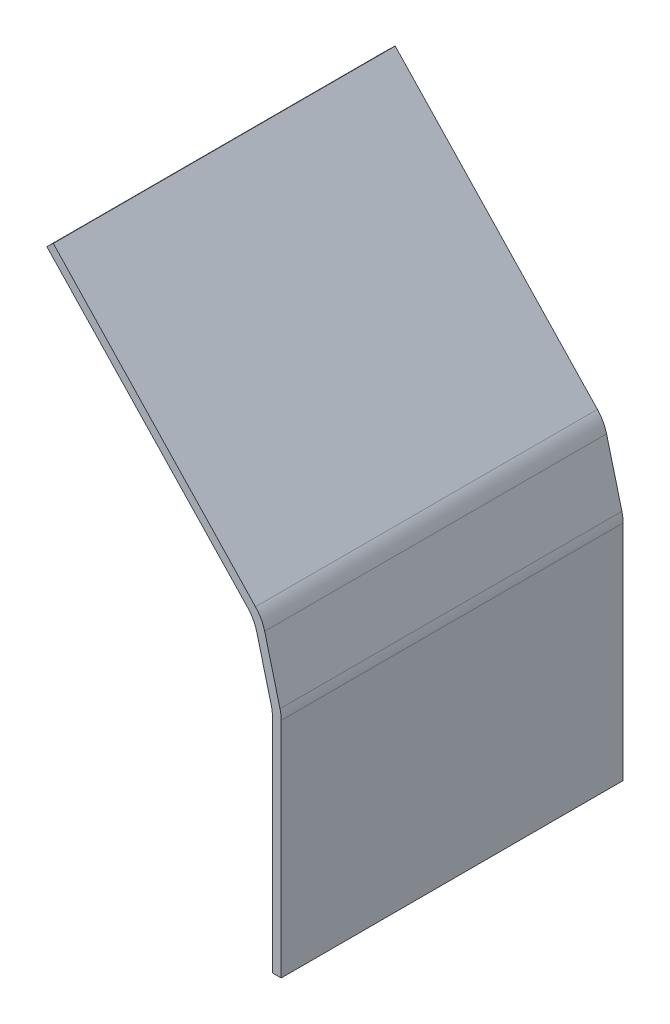
ISO-10303-21;
HEADER;
FILE_DESCRIPTION(('STEP AP214'),'2;1');
FILE_NAME('part.step','',(''),(''),'','','');
FILE_SCHEMA(('AUTOMOTIVE_DESIGN { 1 0 10303 214 1 1 1 1 }'));
ENDSEC;
DATA;
#1=APPLICATION_CONTEXT('core data for automotive mechanical design processes');
#2=APPLICATION_PROTOCOL_DEFINITION('international standard','automotive_design',2000,#1);
#3=PRODUCT_CONTEXT('',#1,'mechanical');
#4=PRODUCT('Part','Part','',(#3));
#5=PRODUCT_RELATED_PRODUCT_CATEGORY('part','',(#4));
#6=PRODUCT_DEFINITION_FORMATION('','',#4);
#7=PRODUCT_DEFINITION_CONTEXT('part definition',#1,'design');
#8=PRODUCT_DEFINITION('design','',#6,#7);
#9=PRODUCT_DEFINITION_SHAPE('','',#8);
#10=(LENGTH_UNIT() NAMED_UNIT(*) SI_UNIT(.MILLI.,.METRE.));
#11=(NAMED_UNIT(*) PLANE_ANGLE_UNIT() SI_UNIT($,.RADIAN.));
#12=(NAMED_UNIT(*) SI_UNIT($,.STERADIAN.) SOLID_ANGLE_UNIT());
#13=UNCERTAINTY_MEASURE_WITH_UNIT(LENGTH_MEASURE(1.E-05),#10,'distance_accuracy_value','');
#14=(GEOMETRIC_REPRESENTATION_CONTEXT(3) GLOBAL_UNCERTAINTY_ASSIGNED_CONTEXT((#13)) GLOBAL_UNIT_ASSIGNED_CONTEXT((#10,
#11,#12)) REPRESENTATION_CONTEXT('',''));
#15=CARTESIAN_POINT('',(0.,0.,0.));
#16=DIRECTION('',(0.,0.,1.));
#17=DIRECTION('',(1.,0.,0.));
#18=AXIS2_PLACEMENT_3D('',#15,#16,#17);
#19=CARTESIAN_POINT('',(-1.4732,0.,-57.15));
#20=DIRECTION('',(0.,-1.,0.));
#21=DIRECTION('',(0.,0.,-1.));
#22=AXIS2_PLACEMENT_3D('',#19,#20,#21);
#23=PLANE('',#22);
#24=DIRECTION('',(1.,0.,0.));
#25=VECTOR('',#24,1.);
#26=CARTESIAN_POINT('',(-1.4732,0.,0.));
#27=LINE('',#26,#25);
#28=CARTESIAN_POINT('',(-1.4732,0.,0.));
#29=VERTEX_POINT('',#28);
#30=CARTESIAN_POINT('',(0.,0.,0.));
#31=VERTEX_POINT('',#30);
#32=EDGE_CURVE('E184',#29,#31,#27,.T.);
#33=ORIENTED_EDGE('',*,*,#32,.F.);
#34=DIRECTION('',(0.,0.,1.));
#35=VECTOR('',#34,1.);
#36=CARTESIAN_POINT('',(-1.4732,0.,-57.15));
#37=LINE('',#36,#35);
#38=CARTESIAN_POINT('',(-1.4732,0.,-57.15));
#39=VERTEX_POINT('',#38);
#40=EDGE_CURVE('E157',#39,#29,#37,.T.);
#41=ORIENTED_EDGE('',*,*,#40,.F.);
#42=DIRECTION('',(1.,0.,0.));
#43=VECTOR('',#42,1.);
#44=CARTESIAN_POINT('',(-1.4732,0.,-57.15));
#45=LINE('',#44,#43);
#46=CARTESIAN_POINT('',(0.,0.,-57.15));
#47=VERTEX_POINT('',#46);
#48=EDGE_CURVE('E149',#39,#47,#45,.T.);
#49=ORIENTED_EDGE('',*,*,#48,.T.);
#50=DIRECTION('',(0.,0.,1.));
#51=VECTOR('',#50,1.);
#52=CARTESIAN_POINT('',(0.,0.,-57.15));
#53=LINE('',#52,#51);
#54=EDGE_CURVE('E129',#47,#31,#53,.T.);
#55=ORIENTED_EDGE('',*,*,#54,.T.);
#56=EDGE_LOOP('',(#33,#41,#49,#55));
#57=FACE_BOUND('',#56,.T.);
#58=ADVANCED_FACE('F39',(#57),#23,.T.);
#59=CARTESIAN_POINT('',(-1.4732,0.,-57.15));
#60=DIRECTION('',(-1.,0.,0.));
#61=DIRECTION('',(0.,0.,1.));
#62=AXIS2_PLACEMENT_3D('',#59,#60,#61);
#63=PLANE('',#62);
#64=DIRECTION('',(0.,-1.,0.));
#65=VECTOR('',#64,1.);
#66=CARTESIAN_POINT('',(-1.4732,0.,0.));
#67=LINE('',#66,#65);
#68=CARTESIAN_POINT('',(-1.4732,37.1063233140499,0.));
#69=VERTEX_POINT('',#68);
#70=EDGE_CURVE('E159',#69,#29,#67,.T.);
#71=ORIENTED_EDGE('',*,*,#70,.F.);
#72=DIRECTION('',(0.,0.,1.));
#73=VECTOR('',#72,1.);
#74=CARTESIAN_POINT('',(-1.4732,37.1063233140499,-57.15));
#75=LINE('',#74,#73);
#76=CARTESIAN_POINT('',(-1.4732,37.1063233140499,-57.15));
#77=VERTEX_POINT('',#76);
#78=EDGE_CURVE('E246',#69,#77,#75,.F.);
#79=ORIENTED_EDGE('',*,*,#78,.T.);
#80=DIRECTION('',(0.,-1.,0.));
#81=VECTOR('',#80,1.);
#82=CARTESIAN_POINT('',(-1.4732,0.,-57.15));
#83=LINE('',#82,#81);
#84=EDGE_CURVE('E143',#77,#39,#83,.T.);
#85=ORIENTED_EDGE('',*,*,#84,.T.);
#86=ORIENTED_EDGE('',*,*,#40,.T.);
#87=EDGE_LOOP('',(#71,#79,#85,#86));
#88=FACE_BOUND('',#87,.T.);
#89=ADVANCED_FACE('F298',(#88),#63,.T.);
#90=CARTESIAN_POINT('',(-4.50632511531431,49.6601221242085,-57.15));
#91=DIRECTION('',(-0.968245836551854,-0.25,0.));
#92=DIRECTION('',(0.25,-0.968245836551854,0.));
#93=AXIS2_PLACEMENT_3D('',#90,#91,#92);
#94=PLANE('',#93);
#95=DIRECTION('',(0.25,-0.968245836551854,0.));
#96=VECTOR('',#95,1.);
#97=CARTESIAN_POINT('',(-4.50632511531431,49.6601221242085,-57.15));
#98=LINE('',#97,#96);
#99=CARTESIAN_POINT('',(-4.0964343778407,48.0726221242086,-57.15));
#100=VERTEX_POINT('',#99);
#101=CARTESIAN_POINT('',(-1.67483893789573,38.6938233140499,-57.15));
#102=VERTEX_POINT('',#101);
#103=EDGE_CURVE('E178',#100,#102,#98,.T.);
#104=ORIENTED_EDGE('',*,*,#103,.T.);
#105=DIRECTION('',(0.,0.,1.));
#106=VECTOR('',#105,1.);
#107=CARTESIAN_POINT('',(-1.67483893789573,38.6938233140499,0.));
#108=LINE('',#107,#106);
#109=CARTESIAN_POINT('',(-1.67483893789573,38.6938233140499,0.));
#110=VERTEX_POINT('',#109);
#111=EDGE_CURVE('E242',#102,#110,#108,.T.);
#112=ORIENTED_EDGE('',*,*,#111,.T.);
#113=DIRECTION('',(0.25,-0.968245836551854,0.));
#114=VECTOR('',#113,1.);
#115=CARTESIAN_POINT('',(-4.50632511531431,49.6601221242085,0.));
#116=LINE('',#115,#114);
#117=CARTESIAN_POINT('',(-4.0964343778407,48.0726221242086,0.));
#118=VERTEX_POINT('',#117);
#119=EDGE_CURVE('E162',#118,#110,#116,.T.);
#120=ORIENTED_EDGE('',*,*,#119,.F.);
#121=DIRECTION('',(0.,0.,1.));
#122=VECTOR('',#121,1.);
#123=CARTESIAN_POINT('',(-4.0964343778407,48.0726221242086,-57.15));
#124=LINE('',#123,#122);
#125=EDGE_CURVE('E239',#118,#100,#124,.F.);
#126=ORIENTED_EDGE('',*,*,#125,.T.);
#127=EDGE_LOOP('',(#104,#112,#120,#126));
#128=FACE_BOUND('',#127,.T.);
#129=ADVANCED_FACE('F263',(#128),#94,.T.);
#130=CARTESIAN_POINT('',(-4.50632511531431,49.6601221242085,-57.15));
#131=DIRECTION('',(-0.726184377413891,-0.6875,0.));
#132=DIRECTION('',(0.6875,-0.726184377413891,0.));
#133=AXIS2_PLACEMENT_3D('',#130,#131,#132);
#134=PLANE('',#133);
#135=DIRECTION('',(0.6875,-0.726184377413891,0.));
#136=VECTOR('',#135,1.);
#137=CARTESIAN_POINT('',(-4.50632511531431,49.6601221242085,-57.15));
#138=LINE('',#137,#136);
#139=CARTESIAN_POINT('',(-39.1698148248062,86.2740634968342,-57.15));
#140=VERTEX_POINT('',#139);
#141=CARTESIAN_POINT('',(-5.63352464336677,50.8507471242085,-57.15));
#142=VERTEX_POINT('',#141);
#143=EDGE_CURVE('E175',#140,#142,#138,.T.);
#144=ORIENTED_EDGE('',*,*,#143,.T.);
#145=DIRECTION('',(0.,0.,1.));
#146=VECTOR('',#145,1.);
#147=CARTESIAN_POINT('',(-5.63352464336677,50.8507471242085,0.));
#148=LINE('',#147,#146);
#149=CARTESIAN_POINT('',(-5.63352464336677,50.8507471242085,0.));
#150=VERTEX_POINT('',#149);
#151=EDGE_CURVE('E249',#142,#150,#148,.T.);
#152=ORIENTED_EDGE('',*,*,#151,.T.);
#153=DIRECTION('',(0.6875,-0.726184377413891,0.));
#154=VECTOR('',#153,1.);
#155=CARTESIAN_POINT('',(-4.50632511531431,49.6601221242085,0.));
#156=LINE('',#155,#154);
#157=CARTESIAN_POINT('',(-39.1698148248062,86.2740634968342,0.));
#158=VERTEX_POINT('',#157);
#159=EDGE_CURVE('E200',#158,#150,#156,.T.);
#160=ORIENTED_EDGE('',*,*,#159,.F.);
#161=DIRECTION('',(0.,0.,1.));
#162=VECTOR('',#161,1.);
#163=CARTESIAN_POINT('',(-39.1698148248062,86.2740634968342,-57.15));
#164=LINE('',#163,#162);
#165=EDGE_CURVE('E210',#140,#158,#164,.T.);
#166=ORIENTED_EDGE('',*,*,#165,.F.);
#167=EDGE_LOOP('',(#144,#152,#160,#166));
#168=FACE_BOUND('',#167,.T.);
#169=ADVANCED_FACE('F266',(#168),#134,.T.);
#170=CARTESIAN_POINT('',(-39.1698148248062,86.2740634968342,-57.15));
#171=DIRECTION('',(-0.687499999999999,0.726184377413892,0.));
#172=DIRECTION('',(-0.726184377413892,-0.687499999999999,0.));
#173=AXIS2_PLACEMENT_3D('',#170,#171,#172);
#174=PLANE('',#173);
#175=DIRECTION('',(-0.726184377413892,-0.687499999999999,0.));
#176=VECTOR('',#175,1.);
#177=CARTESIAN_POINT('',(-39.1698148248062,86.2740634968342,0.));
#178=LINE('',#177,#176);
#179=CARTESIAN_POINT('',(-38.1,87.2868884968342,0.));
#180=VERTEX_POINT('',#179);
#181=EDGE_CURVE('E196',#180,#158,#178,.T.);
#182=ORIENTED_EDGE('',*,*,#181,.F.);
#183=DIRECTION('',(0.,0.,1.));
#184=VECTOR('',#183,1.);
#185=CARTESIAN_POINT('',(-38.1,87.2868884968342,-57.15));
#186=LINE('',#185,#184);
#187=CARTESIAN_POINT('',(-38.1,87.2868884968342,-57.15));
#188=VERTEX_POINT('',#187);
#189=EDGE_CURVE('E142',#188,#180,#186,.T.);
#190=ORIENTED_EDGE('',*,*,#189,.F.);
#191=DIRECTION('',(-0.726184377413892,-0.687499999999999,0.));
#192=VECTOR('',#191,1.);
#193=CARTESIAN_POINT('',(-39.1698148248062,86.2740634968342,-57.15));
#194=LINE('',#193,#192);
#195=EDGE_CURVE('E171',#188,#140,#194,.T.);
#196=ORIENTED_EDGE('',*,*,#195,.T.);
#197=ORIENTED_EDGE('',*,*,#165,.T.);
#198=EDGE_LOOP('',(#182,#190,#196,#197));
#199=FACE_BOUND('',#198,.T.);
#200=ADVANCED_FACE('F272',(#199),#174,.T.);
#201=CARTESIAN_POINT('',(-3.17500000000001,50.3967221242086,-57.15));
#202=DIRECTION('',(0.726184377413891,0.6875,0.));
#203=DIRECTION('',(-0.6875,0.726184377413891,0.));
#204=AXIS2_PLACEMENT_3D('',#201,#202,#203);
#205=PLANE('',#204);
#206=DIRECTION('',(-0.6875,0.72618437741389,0.));
#207=VECTOR('',#206,1.);
#208=CARTESIAN_POINT('',(-3.17500000000001,50.3967221242086,0.));
#209=LINE('',#208,#207);
#210=CARTESIAN_POINT('',(-4.30219952805246,51.5873471242085,0.));
#211=VERTEX_POINT('',#210);
#212=EDGE_CURVE('E193',#211,#180,#209,.T.);
#213=ORIENTED_EDGE('',*,*,#212,.F.);
#214=DIRECTION('',(0.,0.,1.));
#215=VECTOR('',#214,1.);
#216=CARTESIAN_POINT('',(-4.30219952805246,51.5873471242085,-57.15));
#217=LINE('',#216,#215);
#218=CARTESIAN_POINT('',(-4.30219952805246,51.5873471242085,-57.15));
#219=VERTEX_POINT('',#218);
#220=EDGE_CURVE('E236',#211,#219,#217,.F.);
#221=ORIENTED_EDGE('',*,*,#220,.T.);
#222=DIRECTION('',(-0.6875,0.72618437741389,0.));
#223=VECTOR('',#222,1.);
#224=CARTESIAN_POINT('',(-3.17500000000001,50.3967221242086,-57.15));
#225=LINE('',#224,#223);
#226=EDGE_CURVE('E168',#219,#188,#225,.T.);
#227=ORIENTED_EDGE('',*,*,#226,.T.);
#228=ORIENTED_EDGE('',*,*,#189,.T.);
#229=EDGE_LOOP('',(#213,#221,#227,#228));
#230=FACE_BOUND('',#229,.T.);
#231=ADVANCED_FACE('F275',(#230),#205,.T.);
#232=CARTESIAN_POINT('',(-3.17500000000001,50.3967221242086,-57.15));
#233=DIRECTION('',(0.968245836551854,0.25,0.));
#234=DIRECTION('',(-0.25,0.968245836551854,0.));
#235=AXIS2_PLACEMENT_3D('',#232,#233,#234);
#236=PLANE('',#235);
#237=DIRECTION('',(-0.25,0.968245836551854,0.));
#238=VECTOR('',#237,1.);
#239=CARTESIAN_POINT('',(-3.17500000000001,50.3967221242086,0.));
#240=LINE('',#239,#238);
#241=CARTESIAN_POINT('',(-0.201638937895728,38.8809442484171,0.));
#242=VERTEX_POINT('',#241);
#243=CARTESIAN_POINT('',(-2.76510926252639,48.8092221242086,0.));
#244=VERTEX_POINT('',#243);
#245=EDGE_CURVE('E189',#242,#244,#240,.T.);
#246=ORIENTED_EDGE('',*,*,#245,.F.);
#247=DIRECTION('',(0.,0.,1.));
#248=VECTOR('',#247,1.);
#249=CARTESIAN_POINT('',(-0.201638937895728,38.8809442484171,-57.15));
#250=LINE('',#249,#248);
#251=CARTESIAN_POINT('',(-0.201638937895728,38.8809442484171,-57.15));
#252=VERTEX_POINT('',#251);
#253=EDGE_CURVE('E228',#242,#252,#250,.F.);
#254=ORIENTED_EDGE('',*,*,#253,.T.);
#255=DIRECTION('',(-0.25,0.968245836551854,0.));
#256=VECTOR('',#255,1.);
#257=CARTESIAN_POINT('',(-3.17500000000001,50.3967221242086,-57.15));
#258=LINE('',#257,#256);
#259=CARTESIAN_POINT('',(-2.76510926252639,48.8092221242086,-57.15));
#260=VERTEX_POINT('',#259);
#261=EDGE_CURVE('E153',#252,#260,#258,.T.);
#262=ORIENTED_EDGE('',*,*,#261,.T.);
#263=DIRECTION('',(0.,0.,1.));
#264=VECTOR('',#263,1.);
#265=CARTESIAN_POINT('',(-2.76510926252639,48.8092221242086,-57.15));
#266=LINE('',#265,#264);
#267=EDGE_CURVE('E224',#260,#244,#266,.T.);
#268=ORIENTED_EDGE('',*,*,#267,.T.);
#269=EDGE_LOOP('',(#246,#254,#262,#268));
#270=FACE_BOUND('',#269,.T.);
#271=ADVANCED_FACE('F283',(#270),#236,.T.);
#272=CARTESIAN_POINT('',(0.,0.,-57.15));
#273=DIRECTION('',(1.,0.,0.));
#274=DIRECTION('',(0.,0.,-1.));
#275=AXIS2_PLACEMENT_3D('',#272,#273,#274);
#276=PLANE('',#275);
#277=DIRECTION('',(0.,1.,0.));
#278=VECTOR('',#277,1.);
#279=CARTESIAN_POINT('',(0.,0.,-57.15));
#280=LINE('',#279,#278);
#281=CARTESIAN_POINT('',(0.,37.2934442484171,-57.15));
#282=VERTEX_POINT('',#281);
#283=EDGE_CURVE('E133',#47,#282,#280,.T.);
#284=ORIENTED_EDGE('',*,*,#283,.T.);
#285=DIRECTION('',(0.,0.,1.));
#286=VECTOR('',#285,1.);
#287=CARTESIAN_POINT('',(0.,37.2934442484171,-57.15));
#288=LINE('',#287,#286);
#289=CARTESIAN_POINT('',(0.,37.2934442484171,0.));
#290=VERTEX_POINT('',#289);
#291=EDGE_CURVE('E209',#282,#290,#288,.T.);
#292=ORIENTED_EDGE('',*,*,#291,.T.);
#293=DIRECTION('',(0.,1.,0.));
#294=VECTOR('',#293,1.);
#295=CARTESIAN_POINT('',(0.,0.,0.));
#296=LINE('',#295,#294);
#297=EDGE_CURVE('E136',#31,#290,#296,.T.);
#298=ORIENTED_EDGE('',*,*,#297,.F.);
#299=ORIENTED_EDGE('',*,*,#54,.F.);
#300=EDGE_LOOP('',(#284,#292,#298,#299));
#301=FACE_BOUND('',#300,.T.);
#302=ADVANCED_FACE('F131',(#301),#276,.T.);
#303=CARTESIAN_POINT('',(0.,0.,-57.15));
#304=DIRECTION('',(0.,0.,1.));
#305=DIRECTION('',(1.,0.,0.));
#306=AXIS2_PLACEMENT_3D('',#303,#304,#305);
#307=PLANE('',#306);
#308=ORIENTED_EDGE('',*,*,#261,.F.);
#309=CARTESIAN_POINT('',(-6.35,37.2934442484171,-57.15));
#310=DIRECTION('',(0.,0.,1.));
#311=DIRECTION('',(1.,0.,0.));
#312=AXIS2_PLACEMENT_3D('',#309,#310,#311);
#313=CIRCLE('',#312,6.35);
#314=EDGE_CURVE('E151',#252,#282,#313,.F.);
#315=ORIENTED_EDGE('',*,*,#314,.T.);
#316=ORIENTED_EDGE('',*,*,#283,.F.);
#317=ORIENTED_EDGE('',*,*,#48,.F.);
#318=ORIENTED_EDGE('',*,*,#84,.F.);
#319=CARTESIAN_POINT('',(-7.8232,37.1063233140499,-57.15));
#320=DIRECTION('',(0.,0.,1.));
#321=DIRECTION('',(1.,0.,0.));
#322=AXIS2_PLACEMENT_3D('',#319,#320,#321);
#323=CIRCLE('',#322,6.35);
#324=EDGE_CURVE('E255',#77,#102,#323,.T.);
#325=ORIENTED_EDGE('',*,*,#324,.T.);
#326=ORIENTED_EDGE('',*,*,#103,.F.);
#327=CARTESIAN_POINT('',(-10.244795439945,46.4851221242085,-57.15));
#328=DIRECTION('',(0.,0.,1.));
#329=DIRECTION('',(1.,0.,0.));
#330=AXIS2_PLACEMENT_3D('',#327,#328,#329);
#331=CIRCLE('',#330,6.35);
#332=EDGE_CURVE('E11',#100,#142,#331,.T.);
#333=ORIENTED_EDGE('',*,*,#332,.T.);
#334=ORIENTED_EDGE('',*,*,#143,.F.);
#335=ORIENTED_EDGE('',*,*,#195,.F.);
#336=ORIENTED_EDGE('',*,*,#226,.F.);
#337=CARTESIAN_POINT('',(-8.91347032463066,47.2217221242086,-57.15));
#338=DIRECTION('',(0.,0.,1.));
#339=DIRECTION('',(1.,0.,0.));
#340=AXIS2_PLACEMENT_3D('',#337,#338,#339);
#341=CIRCLE('',#340,6.35);
#342=EDGE_CURVE('E231',#219,#260,#341,.F.);
#343=ORIENTED_EDGE('',*,*,#342,.T.);
#344=EDGE_LOOP('',(#308,#315,#316,#317,#318,#325,#326,#333,#334,#335,#336,#343));
#345=FACE_BOUND('',#344,.T.);
#346=ADVANCED_FACE('F147',(#345),#307,.F.);
#347=CARTESIAN_POINT('',(0.,0.,0.));
#348=DIRECTION('',(0.,0.,1.));
#349=DIRECTION('',(1.,0.,0.));
#350=AXIS2_PLACEMENT_3D('',#347,#348,#349);
#351=PLANE('',#350);
#352=ORIENTED_EDGE('',*,*,#297,.T.);
#353=CARTESIAN_POINT('',(-6.35,37.2934442484171,0.));
#354=DIRECTION('',(0.,0.,1.));
#355=DIRECTION('',(1.,0.,0.));
#356=AXIS2_PLACEMENT_3D('',#353,#354,#355);
#357=CIRCLE('',#356,6.35);
#358=EDGE_CURVE('E221',#290,#242,#357,.T.);
#359=ORIENTED_EDGE('',*,*,#358,.T.);
#360=ORIENTED_EDGE('',*,*,#245,.T.);
#361=CARTESIAN_POINT('',(-8.91347032463066,47.2217221242086,0.));
#362=DIRECTION('',(0.,0.,1.));
#363=DIRECTION('',(1.,0.,0.));
#364=AXIS2_PLACEMENT_3D('',#361,#362,#363);
#365=CIRCLE('',#364,6.35);
#366=EDGE_CURVE('E218',#244,#211,#365,.T.);
#367=ORIENTED_EDGE('',*,*,#366,.T.);
#368=ORIENTED_EDGE('',*,*,#212,.T.);
#369=ORIENTED_EDGE('',*,*,#181,.T.);
#370=ORIENTED_EDGE('',*,*,#159,.T.);
#371=CARTESIAN_POINT('',(-10.244795439945,46.4851221242085,0.));
#372=DIRECTION('',(0.,0.,1.));
#373=DIRECTION('',(1.,0.,0.));
#374=AXIS2_PLACEMENT_3D('',#371,#372,#373);
#375=CIRCLE('',#374,6.35);
#376=EDGE_CURVE('E48',#150,#118,#375,.F.);
#377=ORIENTED_EDGE('',*,*,#376,.T.);
#378=ORIENTED_EDGE('',*,*,#119,.T.);
#379=CARTESIAN_POINT('',(-7.8232,37.1063233140499,0.));
#380=DIRECTION('',(0.,0.,1.));
#381=DIRECTION('',(1.,0.,0.));
#382=AXIS2_PLACEMENT_3D('',#379,#380,#381);
#383=CIRCLE('',#382,6.35);
#384=EDGE_CURVE('E252',#110,#69,#383,.F.);
#385=ORIENTED_EDGE('',*,*,#384,.T.);
#386=ORIENTED_EDGE('',*,*,#70,.T.);
#387=ORIENTED_EDGE('',*,*,#32,.T.);
#388=EDGE_LOOP('',(#352,#359,#360,#367,#368,#369,#370,#377,#378,#385,#386,#387));
#389=FACE_BOUND('',#388,.T.);
#390=ADVANCED_FACE('F260',(#389),#351,.T.);
#391=CARTESIAN_POINT('',(-6.35,37.2934442484171,-57.15));
#392=DIRECTION('',(0.,0.,1.));
#393=DIRECTION('',(1.,0.,0.));
#394=AXIS2_PLACEMENT_3D('',#391,#392,#393);
#395=CYLINDRICAL_SURFACE('',#394,6.35);
#396=ORIENTED_EDGE('',*,*,#314,.F.);
#397=ORIENTED_EDGE('',*,*,#253,.F.);
#398=ORIENTED_EDGE('',*,*,#358,.F.);
#399=ORIENTED_EDGE('',*,*,#291,.F.);
#400=EDGE_LOOP('',(#396,#397,#398,#399));
#401=FACE_BOUND('',#400,.T.);
#402=ADVANCED_FACE('F286',(#401),#395,.T.);
#403=CARTESIAN_POINT('',(-8.91347032463066,47.2217221242086,-57.15));
#404=DIRECTION('',(0.,0.,1.));
#405=DIRECTION('',(1.,0.,0.));
#406=AXIS2_PLACEMENT_3D('',#403,#404,#405);
#407=CYLINDRICAL_SURFACE('',#406,6.35);
#408=ORIENTED_EDGE('',*,*,#342,.F.);
#409=ORIENTED_EDGE('',*,*,#220,.F.);
#410=ORIENTED_EDGE('',*,*,#366,.F.);
#411=ORIENTED_EDGE('',*,*,#267,.F.);
#412=EDGE_LOOP('',(#408,#409,#410,#411));
#413=FACE_BOUND('',#412,.T.);
#414=ADVANCED_FACE('F280',(#413),#407,.T.);
#415=CARTESIAN_POINT('',(-7.8232,37.1063233140499,-57.15));
#416=DIRECTION('',(0.,0.,-1.));
#417=DIRECTION('',(-1.,0.,0.));
#418=AXIS2_PLACEMENT_3D('',#415,#416,#417);
#419=CYLINDRICAL_SURFACE('',#418,6.35);
#420=ORIENTED_EDGE('',*,*,#324,.F.);
#421=ORIENTED_EDGE('',*,*,#78,.F.);
#422=ORIENTED_EDGE('',*,*,#384,.F.);
#423=ORIENTED_EDGE('',*,*,#111,.F.);
#424=EDGE_LOOP('',(#420,#421,#422,#423));
#425=FACE_BOUND('',#424,.T.);
#426=ADVANCED_FACE('F293',(#425),#419,.F.);
#427=CARTESIAN_POINT('',(-10.244795439945,46.4851221242085,-57.15));
#428=DIRECTION('',(0.,0.,-1.));
#429=DIRECTION('',(-1.,0.,0.));
#430=AXIS2_PLACEMENT_3D('',#427,#428,#429);
#431=CYLINDRICAL_SURFACE('',#430,6.35);
#432=ORIENTED_EDGE('',*,*,#332,.F.);
#433=ORIENTED_EDGE('',*,*,#125,.F.);
#434=ORIENTED_EDGE('',*,*,#376,.F.);
#435=ORIENTED_EDGE('',*,*,#151,.F.);
#436=EDGE_LOOP('',(#432,#433,#434,#435));
#437=FACE_BOUND('',#436,.T.);
#438=ADVANCED_FACE('F41',(#437),#431,.F.);
#439=CLOSED_SHELL('',(#58,#89,#129,#169,#200,#231,#271,#302,#346,#390,#402,#414,#426,#438));
#440=MANIFOLD_SOLID_BREP('B2',#439);
#441=ADVANCED_BREP_SHAPE_REPRESENTATION('',(#18,#440),#14);
#442=SHAPE_DEFINITION_REPRESENTATION(#9,#441);
ENDSEC;
END-ISO-10303-21;
